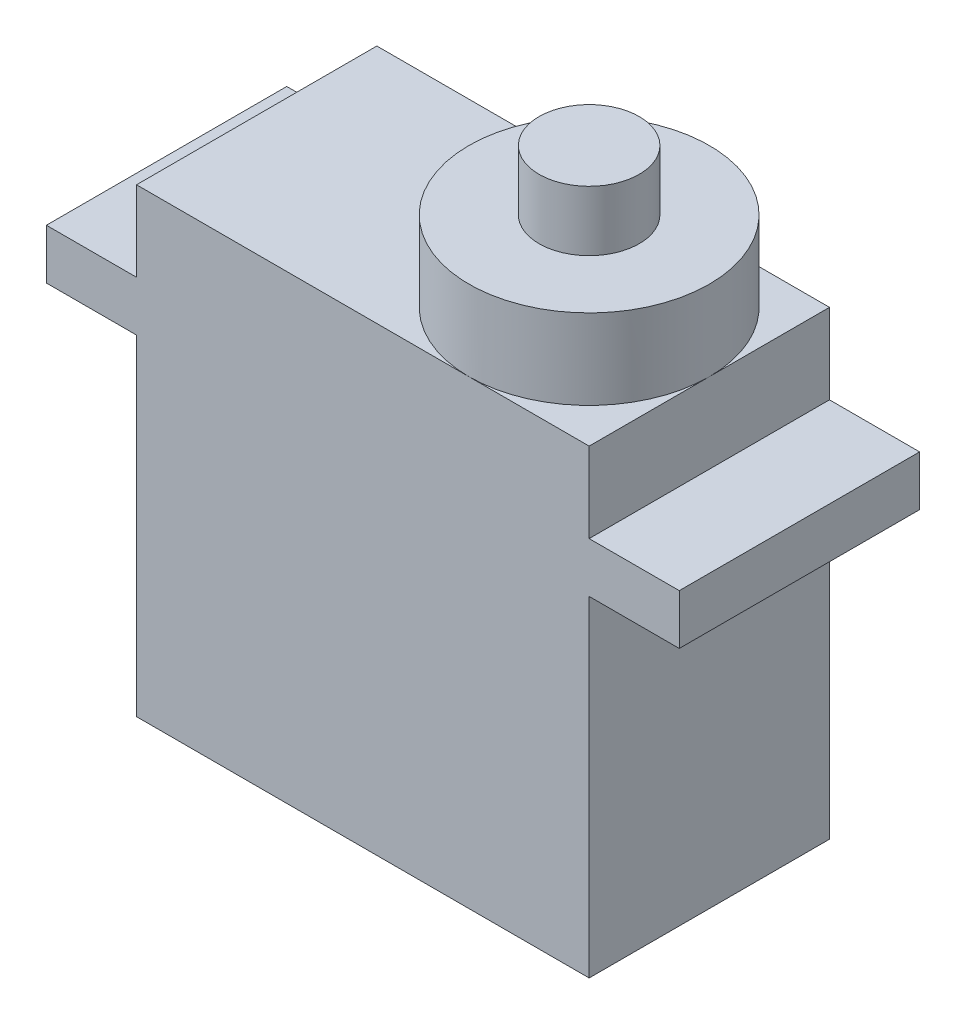
ISO-10303-21;
HEADER;
FILE_DESCRIPTION(('STEP AP214'),'2;1');
FILE_NAME('part.step','',(''),(''),'','','');
FILE_SCHEMA(('AUTOMOTIVE_DESIGN { 1 0 10303 214 1 1 1 1 }'));
ENDSEC;
DATA;
#1=APPLICATION_CONTEXT('core data for automotive mechanical design processes');
#2=APPLICATION_PROTOCOL_DEFINITION('international standard','automotive_design',2000,#1);
#3=PRODUCT_CONTEXT('',#1,'mechanical');
#4=PRODUCT('Part','Part','',(#3));
#5=PRODUCT_RELATED_PRODUCT_CATEGORY('part','',(#4));
#6=PRODUCT_DEFINITION_FORMATION('','',#4);
#7=PRODUCT_DEFINITION_CONTEXT('part definition',#1,'design');
#8=PRODUCT_DEFINITION('design','',#6,#7);
#9=PRODUCT_DEFINITION_SHAPE('','',#8);
#10=(LENGTH_UNIT() NAMED_UNIT(*) SI_UNIT(.MILLI.,.METRE.));
#11=(NAMED_UNIT(*) PLANE_ANGLE_UNIT() SI_UNIT($,.RADIAN.));
#12=(NAMED_UNIT(*) SI_UNIT($,.STERADIAN.) SOLID_ANGLE_UNIT());
#13=UNCERTAINTY_MEASURE_WITH_UNIT(LENGTH_MEASURE(1.E-05),#10,'distance_accuracy_value','');
#14=(GEOMETRIC_REPRESENTATION_CONTEXT(3) GLOBAL_UNCERTAINTY_ASSIGNED_CONTEXT((#13)) GLOBAL_UNIT_ASSIGNED_CONTEXT((#10,
#11,#12)) REPRESENTATION_CONTEXT('',''));
#15=CARTESIAN_POINT('',(0.,0.,0.));
#16=DIRECTION('',(0.,0.,1.));
#17=DIRECTION('',(1.,0.,0.));
#18=AXIS2_PLACEMENT_3D('',#15,#16,#17);
#19=CARTESIAN_POINT('',(0.,23.,12.));
#20=DIRECTION('',(0.,-1.,0.));
#21=DIRECTION('',(1.,0.,0.));
#22=AXIS2_PLACEMENT_3D('',#19,#20,#21);
#23=PLANE('',#22);
#24=CARTESIAN_POINT('',(-6.,23.,6.));
#25=DIRECTION('',(0.,1.,0.));
#26=DIRECTION('',(-1.,0.,0.));
#27=AXIS2_PLACEMENT_3D('',#24,#25,#26);
#28=CIRCLE('',#27,6.);
#29=CARTESIAN_POINT('',(-6.,23.,12.));
#30=VERTEX_POINT('',#29);
#31=CARTESIAN_POINT('',(0.,23.,6.));
#32=VERTEX_POINT('',#31);
#33=EDGE_CURVE('E168',#30,#32,#28,.T.);
#34=ORIENTED_EDGE('',*,*,#33,.F.);
#35=DIRECTION('',(-1.,0.,0.));
#36=VECTOR('',#35,1.);
#37=CARTESIAN_POINT('',(0.,23.,12.));
#38=LINE('',#37,#36);
#39=CARTESIAN_POINT('',(0.,23.,12.));
#40=VERTEX_POINT('',#39);
#41=EDGE_CURVE('E148',#40,#30,#38,.T.);
#42=ORIENTED_EDGE('',*,*,#41,.F.);
#43=DIRECTION('',(0.,0.,-1.));
#44=VECTOR('',#43,1.);
#45=CARTESIAN_POINT('',(0.,23.,12.));
#46=LINE('',#45,#44);
#47=EDGE_CURVE('E169',#40,#32,#46,.T.);
#48=ORIENTED_EDGE('',*,*,#47,.T.);
#49=EDGE_LOOP('',(#34,#42,#48));
#50=FACE_BOUND('',#49,.T.);
#51=ADVANCED_FACE('F47',(#50),#23,.F.);
#52=CARTESIAN_POINT('',(-6.,23.,0.));
#53=VERTEX_POINT('',#52);
#54=EDGE_CURVE('E57',#32,#53,#28,.T.);
#55=ORIENTED_EDGE('',*,*,#54,.F.);
#56=CARTESIAN_POINT('',(0.,23.,0.));
#57=VERTEX_POINT('',#56);
#58=EDGE_CURVE('E275',#32,#57,#46,.T.);
#59=ORIENTED_EDGE('',*,*,#58,.T.);
#60=DIRECTION('',(-1.,0.,0.));
#61=VECTOR('',#60,1.);
#62=CARTESIAN_POINT('',(0.,23.,0.));
#63=LINE('',#62,#61);
#64=EDGE_CURVE('E237',#57,#53,#63,.T.);
#65=ORIENTED_EDGE('',*,*,#64,.T.);
#66=EDGE_LOOP('',(#55,#59,#65));
#67=FACE_BOUND('',#66,.T.);
#68=ADVANCED_FACE('F350',(#67),#23,.F.);
#69=CARTESIAN_POINT('',(-22.6,0.,12.));
#70=DIRECTION('',(0.,1.,0.));
#71=DIRECTION('',(0.,0.,1.));
#72=AXIS2_PLACEMENT_3D('',#69,#70,#71);
#73=PLANE('',#72);
#74=DIRECTION('',(1.,0.,0.));
#75=VECTOR('',#74,1.);
#76=CARTESIAN_POINT('',(-22.6,0.,0.));
#77=LINE('',#76,#75);
#78=CARTESIAN_POINT('',(-22.6,0.,0.));
#79=VERTEX_POINT('',#78);
#80=CARTESIAN_POINT('',(0.,0.,0.));
#81=VERTEX_POINT('',#80);
#82=EDGE_CURVE('E216',#79,#81,#77,.T.);
#83=ORIENTED_EDGE('',*,*,#82,.T.);
#84=DIRECTION('',(0.,0.,-1.));
#85=VECTOR('',#84,1.);
#86=CARTESIAN_POINT('',(0.,0.,12.));
#87=LINE('',#86,#85);
#88=CARTESIAN_POINT('',(0.,0.,12.));
#89=VERTEX_POINT('',#88);
#90=EDGE_CURVE('E51',#89,#81,#87,.T.);
#91=ORIENTED_EDGE('',*,*,#90,.F.);
#92=DIRECTION('',(1.,0.,0.));
#93=VECTOR('',#92,1.);
#94=CARTESIAN_POINT('',(-22.6,0.,12.));
#95=LINE('',#94,#93);
#96=CARTESIAN_POINT('',(-22.6,0.,12.));
#97=VERTEX_POINT('',#96);
#98=EDGE_CURVE('E183',#97,#89,#95,.T.);
#99=ORIENTED_EDGE('',*,*,#98,.F.);
#100=DIRECTION('',(0.,0.,-1.));
#101=VECTOR('',#100,1.);
#102=CARTESIAN_POINT('',(-22.6,0.,12.));
#103=LINE('',#102,#101);
#104=EDGE_CURVE('E215',#97,#79,#103,.T.);
#105=ORIENTED_EDGE('',*,*,#104,.T.);
#106=EDGE_LOOP('',(#83,#91,#99,#105));
#107=FACE_BOUND('',#106,.T.);
#108=ADVANCED_FACE('F49',(#107),#73,.F.);
#109=CARTESIAN_POINT('',(0.,0.,12.));
#110=DIRECTION('',(-1.,0.,0.));
#111=DIRECTION('',(0.,-1.,0.));
#112=AXIS2_PLACEMENT_3D('',#109,#110,#111);
#113=PLANE('',#112);
#114=DIRECTION('',(0.,1.,0.));
#115=VECTOR('',#114,1.);
#116=CARTESIAN_POINT('',(0.,0.,0.));
#117=LINE('',#116,#115);
#118=CARTESIAN_POINT('',(0.,16.5,0.));
#119=VERTEX_POINT('',#118);
#120=EDGE_CURVE('E220',#81,#119,#117,.T.);
#121=ORIENTED_EDGE('',*,*,#120,.T.);
#122=DIRECTION('',(0.,0.,-1.));
#123=VECTOR('',#122,1.);
#124=CARTESIAN_POINT('',(0.,16.5,12.));
#125=LINE('',#124,#123);
#126=CARTESIAN_POINT('',(0.,16.5,12.));
#127=VERTEX_POINT('',#126);
#128=EDGE_CURVE('E180',#127,#119,#125,.T.);
#129=ORIENTED_EDGE('',*,*,#128,.F.);
#130=DIRECTION('',(0.,1.,0.));
#131=VECTOR('',#130,1.);
#132=CARTESIAN_POINT('',(0.,0.,12.));
#133=LINE('',#132,#131);
#134=EDGE_CURVE('E186',#89,#127,#133,.T.);
#135=ORIENTED_EDGE('',*,*,#134,.F.);
#136=ORIENTED_EDGE('',*,*,#90,.T.);
#137=EDGE_LOOP('',(#121,#129,#135,#136));
#138=FACE_BOUND('',#137,.T.);
#139=ADVANCED_FACE('F314',(#138),#113,.F.);
#140=CARTESIAN_POINT('',(0.,16.5,12.));
#141=DIRECTION('',(0.,1.,0.));
#142=DIRECTION('',(0.,0.,1.));
#143=AXIS2_PLACEMENT_3D('',#140,#141,#142);
#144=PLANE('',#143);
#145=DIRECTION('',(1.,0.,0.));
#146=VECTOR('',#145,1.);
#147=CARTESIAN_POINT('',(0.,16.5,0.));
#148=LINE('',#147,#146);
#149=CARTESIAN_POINT('',(4.5,16.5,0.));
#150=VERTEX_POINT('',#149);
#151=EDGE_CURVE('E223',#119,#150,#148,.T.);
#152=ORIENTED_EDGE('',*,*,#151,.T.);
#153=DIRECTION('',(0.,0.,-1.));
#154=VECTOR('',#153,1.);
#155=CARTESIAN_POINT('',(4.5,16.5,12.));
#156=LINE('',#155,#154);
#157=CARTESIAN_POINT('',(4.5,16.5,12.));
#158=VERTEX_POINT('',#157);
#159=EDGE_CURVE('E286',#158,#150,#156,.T.);
#160=ORIENTED_EDGE('',*,*,#159,.F.);
#161=DIRECTION('',(1.,0.,0.));
#162=VECTOR('',#161,1.);
#163=CARTESIAN_POINT('',(0.,16.5,12.));
#164=LINE('',#163,#162);
#165=EDGE_CURVE('E190',#127,#158,#164,.T.);
#166=ORIENTED_EDGE('',*,*,#165,.F.);
#167=ORIENTED_EDGE('',*,*,#128,.T.);
#168=EDGE_LOOP('',(#152,#160,#166,#167));
#169=FACE_BOUND('',#168,.T.);
#170=ADVANCED_FACE('F295',(#169),#144,.F.);
#171=CARTESIAN_POINT('',(4.5,16.5,12.));
#172=DIRECTION('',(-1.,0.,0.));
#173=DIRECTION('',(0.,0.,1.));
#174=AXIS2_PLACEMENT_3D('',#171,#172,#173);
#175=PLANE('',#174);
#176=DIRECTION('',(0.,1.,0.));
#177=VECTOR('',#176,1.);
#178=CARTESIAN_POINT('',(4.5,16.5,0.));
#179=LINE('',#178,#177);
#180=CARTESIAN_POINT('',(4.5,19.,0.));
#181=VERTEX_POINT('',#180);
#182=EDGE_CURVE('E226',#150,#181,#179,.T.);
#183=ORIENTED_EDGE('',*,*,#182,.T.);
#184=DIRECTION('',(0.,0.,-1.));
#185=VECTOR('',#184,1.);
#186=CARTESIAN_POINT('',(4.5,19.,12.));
#187=LINE('',#186,#185);
#188=CARTESIAN_POINT('',(4.5,19.,12.));
#189=VERTEX_POINT('',#188);
#190=EDGE_CURVE('E282',#189,#181,#187,.T.);
#191=ORIENTED_EDGE('',*,*,#190,.F.);
#192=DIRECTION('',(0.,1.,0.));
#193=VECTOR('',#192,1.);
#194=CARTESIAN_POINT('',(4.5,16.5,12.));
#195=LINE('',#194,#193);
#196=EDGE_CURVE('E193',#158,#189,#195,.T.);
#197=ORIENTED_EDGE('',*,*,#196,.F.);
#198=ORIENTED_EDGE('',*,*,#159,.T.);
#199=EDGE_LOOP('',(#183,#191,#197,#198));
#200=FACE_BOUND('',#199,.T.);
#201=ADVANCED_FACE('F306',(#200),#175,.F.);
#202=CARTESIAN_POINT('',(4.5,19.,12.));
#203=DIRECTION('',(0.,-1.,0.));
#204=DIRECTION('',(0.,0.,-1.));
#205=AXIS2_PLACEMENT_3D('',#202,#203,#204);
#206=PLANE('',#205);
#207=DIRECTION('',(-1.,0.,0.));
#208=VECTOR('',#207,1.);
#209=CARTESIAN_POINT('',(4.5,19.,0.));
#210=LINE('',#209,#208);
#211=CARTESIAN_POINT('',(0.,19.,0.));
#212=VERTEX_POINT('',#211);
#213=EDGE_CURVE('E229',#181,#212,#210,.T.);
#214=ORIENTED_EDGE('',*,*,#213,.T.);
#215=DIRECTION('',(0.,0.,-1.));
#216=VECTOR('',#215,1.);
#217=CARTESIAN_POINT('',(0.,19.,12.));
#218=LINE('',#217,#216);
#219=CARTESIAN_POINT('',(0.,19.,12.));
#220=VERTEX_POINT('',#219);
#221=EDGE_CURVE('E278',#220,#212,#218,.T.);
#222=ORIENTED_EDGE('',*,*,#221,.F.);
#223=DIRECTION('',(-1.,0.,0.));
#224=VECTOR('',#223,1.);
#225=CARTESIAN_POINT('',(4.5,19.,12.));
#226=LINE('',#225,#224);
#227=EDGE_CURVE('E196',#189,#220,#226,.T.);
#228=ORIENTED_EDGE('',*,*,#227,.F.);
#229=ORIENTED_EDGE('',*,*,#190,.T.);
#230=EDGE_LOOP('',(#214,#222,#228,#229));
#231=FACE_BOUND('',#230,.T.);
#232=ADVANCED_FACE('F310',(#231),#206,.F.);
#233=CARTESIAN_POINT('',(0.,19.,12.));
#234=DIRECTION('',(-1.,0.,0.));
#235=DIRECTION('',(0.,-1.,0.));
#236=AXIS2_PLACEMENT_3D('',#233,#234,#235);
#237=PLANE('',#236);
#238=DIRECTION('',(0.,1.,0.));
#239=VECTOR('',#238,1.);
#240=CARTESIAN_POINT('',(0.,19.,0.));
#241=LINE('',#240,#239);
#242=EDGE_CURVE('E232',#212,#57,#241,.T.);
#243=ORIENTED_EDGE('',*,*,#242,.T.);
#244=ORIENTED_EDGE('',*,*,#58,.F.);
#245=ORIENTED_EDGE('',*,*,#47,.F.);
#246=DIRECTION('',(0.,1.,0.));
#247=VECTOR('',#246,1.);
#248=CARTESIAN_POINT('',(0.,19.,12.));
#249=LINE('',#248,#247);
#250=EDGE_CURVE('E154',#220,#40,#249,.T.);
#251=ORIENTED_EDGE('',*,*,#250,.F.);
#252=ORIENTED_EDGE('',*,*,#221,.T.);
#253=EDGE_LOOP('',(#243,#244,#245,#251,#252));
#254=FACE_BOUND('',#253,.T.);
#255=ADVANCED_FACE('F348',(#254),#237,.F.);
#256=EDGE_CURVE('E72',#53,#30,#28,.T.);
#257=ORIENTED_EDGE('',*,*,#256,.F.);
#258=CARTESIAN_POINT('',(-22.6,23.,0.));
#259=VERTEX_POINT('',#258);
#260=EDGE_CURVE('E236',#53,#259,#63,.T.);
#261=ORIENTED_EDGE('',*,*,#260,.T.);
#262=DIRECTION('',(0.,0.,-1.));
#263=VECTOR('',#262,1.);
#264=CARTESIAN_POINT('',(-22.6,23.,12.));
#265=LINE('',#264,#263);
#266=CARTESIAN_POINT('',(-22.6,23.,12.));
#267=VERTEX_POINT('',#266);
#268=EDGE_CURVE('E164',#267,#259,#265,.T.);
#269=ORIENTED_EDGE('',*,*,#268,.F.);
#270=EDGE_CURVE('E151',#30,#267,#38,.T.);
#271=ORIENTED_EDGE('',*,*,#270,.F.);
#272=EDGE_LOOP('',(#257,#261,#269,#271));
#273=FACE_BOUND('',#272,.T.);
#274=ADVANCED_FACE('F162',(#273),#23,.F.);
#275=CARTESIAN_POINT('',(-22.6,23.,12.));
#276=DIRECTION('',(1.,0.,0.));
#277=DIRECTION('',(0.,1.,0.));
#278=AXIS2_PLACEMENT_3D('',#275,#276,#277);
#279=PLANE('',#278);
#280=DIRECTION('',(0.,-1.,0.));
#281=VECTOR('',#280,1.);
#282=CARTESIAN_POINT('',(-22.6,23.,0.));
#283=LINE('',#282,#281);
#284=CARTESIAN_POINT('',(-22.6,19.,0.));
#285=VERTEX_POINT('',#284);
#286=EDGE_CURVE('E240',#259,#285,#283,.T.);
#287=ORIENTED_EDGE('',*,*,#286,.T.);
#288=DIRECTION('',(0.,0.,-1.));
#289=VECTOR('',#288,1.);
#290=CARTESIAN_POINT('',(-22.6,19.,12.));
#291=LINE('',#290,#289);
#292=CARTESIAN_POINT('',(-22.6,19.,12.));
#293=VERTEX_POINT('',#292);
#294=EDGE_CURVE('E269',#293,#285,#291,.T.);
#295=ORIENTED_EDGE('',*,*,#294,.F.);
#296=DIRECTION('',(0.,-1.,0.));
#297=VECTOR('',#296,1.);
#298=CARTESIAN_POINT('',(-22.6,23.,12.));
#299=LINE('',#298,#297);
#300=EDGE_CURVE('E160',#267,#293,#299,.T.);
#301=ORIENTED_EDGE('',*,*,#300,.F.);
#302=ORIENTED_EDGE('',*,*,#268,.T.);
#303=EDGE_LOOP('',(#287,#295,#301,#302));
#304=FACE_BOUND('',#303,.T.);
#305=ADVANCED_FACE('F339',(#304),#279,.F.);
#306=CARTESIAN_POINT('',(-22.6,19.,12.));
#307=DIRECTION('',(0.,-1.,0.));
#308=DIRECTION('',(0.,0.,-1.));
#309=AXIS2_PLACEMENT_3D('',#306,#307,#308);
#310=PLANE('',#309);
#311=DIRECTION('',(-1.,0.,0.));
#312=VECTOR('',#311,1.);
#313=CARTESIAN_POINT('',(-22.6,19.,0.));
#314=LINE('',#313,#312);
#315=CARTESIAN_POINT('',(-27.1,19.,0.));
#316=VERTEX_POINT('',#315);
#317=EDGE_CURVE('E243',#285,#316,#314,.T.);
#318=ORIENTED_EDGE('',*,*,#317,.T.);
#319=DIRECTION('',(0.,0.,-1.));
#320=VECTOR('',#319,1.);
#321=CARTESIAN_POINT('',(-27.1,19.,12.));
#322=LINE('',#321,#320);
#323=CARTESIAN_POINT('',(-27.1,19.,12.));
#324=VERTEX_POINT('',#323);
#325=EDGE_CURVE('E265',#324,#316,#322,.T.);
#326=ORIENTED_EDGE('',*,*,#325,.F.);
#327=DIRECTION('',(-1.,0.,0.));
#328=VECTOR('',#327,1.);
#329=CARTESIAN_POINT('',(-22.6,19.,12.));
#330=LINE('',#329,#328);
#331=EDGE_CURVE('E203',#293,#324,#330,.T.);
#332=ORIENTED_EDGE('',*,*,#331,.F.);
#333=ORIENTED_EDGE('',*,*,#294,.T.);
#334=EDGE_LOOP('',(#318,#326,#332,#333));
#335=FACE_BOUND('',#334,.T.);
#336=ADVANCED_FACE('F335',(#335),#310,.F.);
#337=CARTESIAN_POINT('',(-27.1,19.,12.));
#338=DIRECTION('',(1.,0.,0.));
#339=DIRECTION('',(0.,0.,-1.));
#340=AXIS2_PLACEMENT_3D('',#337,#338,#339);
#341=PLANE('',#340);
#342=DIRECTION('',(0.,-1.,0.));
#343=VECTOR('',#342,1.);
#344=CARTESIAN_POINT('',(-27.1,19.,0.));
#345=LINE('',#344,#343);
#346=CARTESIAN_POINT('',(-27.1,16.5,0.));
#347=VERTEX_POINT('',#346);
#348=EDGE_CURVE('E246',#316,#347,#345,.T.);
#349=ORIENTED_EDGE('',*,*,#348,.T.);
#350=DIRECTION('',(0.,0.,-1.));
#351=VECTOR('',#350,1.);
#352=CARTESIAN_POINT('',(-27.1,16.5,12.));
#353=LINE('',#352,#351);
#354=CARTESIAN_POINT('',(-27.1,16.5,12.));
#355=VERTEX_POINT('',#354);
#356=EDGE_CURVE('E261',#355,#347,#353,.T.);
#357=ORIENTED_EDGE('',*,*,#356,.F.);
#358=DIRECTION('',(0.,-1.,0.));
#359=VECTOR('',#358,1.);
#360=CARTESIAN_POINT('',(-27.1,19.,12.));
#361=LINE('',#360,#359);
#362=EDGE_CURVE('E206',#324,#355,#361,.T.);
#363=ORIENTED_EDGE('',*,*,#362,.F.);
#364=ORIENTED_EDGE('',*,*,#325,.T.);
#365=EDGE_LOOP('',(#349,#357,#363,#364));
#366=FACE_BOUND('',#365,.T.);
#367=ADVANCED_FACE('F330',(#366),#341,.F.);
#368=CARTESIAN_POINT('',(-27.1,16.5,12.));
#369=DIRECTION('',(0.,1.,0.));
#370=DIRECTION('',(0.,0.,1.));
#371=AXIS2_PLACEMENT_3D('',#368,#369,#370);
#372=PLANE('',#371);
#373=DIRECTION('',(1.,0.,0.));
#374=VECTOR('',#373,1.);
#375=CARTESIAN_POINT('',(-27.1,16.5,0.));
#376=LINE('',#375,#374);
#377=CARTESIAN_POINT('',(-22.6,16.5,0.));
#378=VERTEX_POINT('',#377);
#379=EDGE_CURVE('E249',#347,#378,#376,.T.);
#380=ORIENTED_EDGE('',*,*,#379,.T.);
#381=DIRECTION('',(0.,0.,-1.));
#382=VECTOR('',#381,1.);
#383=CARTESIAN_POINT('',(-22.6,16.5,12.));
#384=LINE('',#383,#382);
#385=CARTESIAN_POINT('',(-22.6,16.5,12.));
#386=VERTEX_POINT('',#385);
#387=EDGE_CURVE('E257',#386,#378,#384,.T.);
#388=ORIENTED_EDGE('',*,*,#387,.F.);
#389=DIRECTION('',(1.,0.,0.));
#390=VECTOR('',#389,1.);
#391=CARTESIAN_POINT('',(-27.1,16.5,12.));
#392=LINE('',#391,#390);
#393=EDGE_CURVE('E209',#355,#386,#392,.T.);
#394=ORIENTED_EDGE('',*,*,#393,.F.);
#395=ORIENTED_EDGE('',*,*,#356,.T.);
#396=EDGE_LOOP('',(#380,#388,#394,#395));
#397=FACE_BOUND('',#396,.T.);
#398=ADVANCED_FACE('F326',(#397),#372,.F.);
#399=CARTESIAN_POINT('',(-22.6,16.5,12.));
#400=DIRECTION('',(1.,0.,0.));
#401=DIRECTION('',(0.,1.,0.));
#402=AXIS2_PLACEMENT_3D('',#399,#400,#401);
#403=PLANE('',#402);
#404=DIRECTION('',(0.,-1.,0.));
#405=VECTOR('',#404,1.);
#406=CARTESIAN_POINT('',(-22.6,16.5,0.));
#407=LINE('',#406,#405);
#408=EDGE_CURVE('E187',#378,#79,#407,.T.);
#409=ORIENTED_EDGE('',*,*,#408,.T.);
#410=ORIENTED_EDGE('',*,*,#104,.F.);
#411=DIRECTION('',(0.,-1.,0.));
#412=VECTOR('',#411,1.);
#413=CARTESIAN_POINT('',(-22.6,16.5,12.));
#414=LINE('',#413,#412);
#415=EDGE_CURVE('E212',#386,#97,#414,.T.);
#416=ORIENTED_EDGE('',*,*,#415,.F.);
#417=ORIENTED_EDGE('',*,*,#387,.T.);
#418=EDGE_LOOP('',(#409,#410,#416,#417));
#419=FACE_BOUND('',#418,.T.);
#420=ADVANCED_FACE('F321',(#419),#403,.F.);
#421=CARTESIAN_POINT('',(0.,0.,12.));
#422=DIRECTION('',(0.,0.,1.));
#423=DIRECTION('',(1.,0.,0.));
#424=AXIS2_PLACEMENT_3D('',#421,#422,#423);
#425=PLANE('',#424);
#426=ORIENTED_EDGE('',*,*,#98,.T.);
#427=ORIENTED_EDGE('',*,*,#134,.T.);
#428=ORIENTED_EDGE('',*,*,#165,.T.);
#429=ORIENTED_EDGE('',*,*,#196,.T.);
#430=ORIENTED_EDGE('',*,*,#227,.T.);
#431=ORIENTED_EDGE('',*,*,#250,.T.);
#432=ORIENTED_EDGE('',*,*,#41,.T.);
#433=ORIENTED_EDGE('',*,*,#270,.T.);
#434=ORIENTED_EDGE('',*,*,#300,.T.);
#435=ORIENTED_EDGE('',*,*,#331,.T.);
#436=ORIENTED_EDGE('',*,*,#362,.T.);
#437=ORIENTED_EDGE('',*,*,#393,.T.);
#438=ORIENTED_EDGE('',*,*,#415,.T.);
#439=EDGE_LOOP('',(#426,#427,#428,#429,#430,#431,#432,#433,#434,#435,#436,#437,#438));
#440=FACE_BOUND('',#439,.T.);
#441=ADVANCED_FACE('F150',(#440),#425,.T.);
#442=CARTESIAN_POINT('',(0.,0.,0.));
#443=DIRECTION('',(0.,0.,1.));
#444=DIRECTION('',(1.,0.,0.));
#445=AXIS2_PLACEMENT_3D('',#442,#443,#444);
#446=PLANE('',#445);
#447=ORIENTED_EDGE('',*,*,#82,.F.);
#448=ORIENTED_EDGE('',*,*,#408,.F.);
#449=ORIENTED_EDGE('',*,*,#379,.F.);
#450=ORIENTED_EDGE('',*,*,#348,.F.);
#451=ORIENTED_EDGE('',*,*,#317,.F.);
#452=ORIENTED_EDGE('',*,*,#286,.F.);
#453=ORIENTED_EDGE('',*,*,#260,.F.);
#454=ORIENTED_EDGE('',*,*,#64,.F.);
#455=ORIENTED_EDGE('',*,*,#242,.F.);
#456=ORIENTED_EDGE('',*,*,#213,.F.);
#457=ORIENTED_EDGE('',*,*,#182,.F.);
#458=ORIENTED_EDGE('',*,*,#151,.F.);
#459=ORIENTED_EDGE('',*,*,#120,.F.);
#460=EDGE_LOOP('',(#447,#448,#449,#450,#451,#452,#453,#454,#455,#456,#457,#458,#459));
#461=FACE_BOUND('',#460,.T.);
#462=ADVANCED_FACE('F301',(#461),#446,.F.);
#463=CARTESIAN_POINT('',(-6.00000000000001,27.,6.));
#464=DIRECTION('',(0.,-1.,0.));
#465=DIRECTION('',(1.,0.,0.));
#466=AXIS2_PLACEMENT_3D('',#463,#464,#465);
#467=CYLINDRICAL_SURFACE('',#466,6.);
#468=CARTESIAN_POINT('',(-6.00000000000001,27.,6.));
#469=DIRECTION('',(0.,1.,0.));
#470=DIRECTION('',(-1.,0.,0.));
#471=AXIS2_PLACEMENT_3D('',#468,#469,#470);
#472=CIRCLE('',#471,6.);
#473=CARTESIAN_POINT('',(-12.,27.,6.));
#474=VERTEX_POINT('',#473);
#475=EDGE_CURVE('E172',#474,#474,#472,.T.);
#476=ORIENTED_EDGE('',*,*,#475,.F.);
#477=EDGE_LOOP('',(#476));
#478=FACE_BOUND('',#477,.T.);
#479=ORIENTED_EDGE('',*,*,#33,.T.);
#480=ORIENTED_EDGE('',*,*,#54,.T.);
#481=ORIENTED_EDGE('',*,*,#256,.T.);
#482=EDGE_LOOP('',(#479,#480,#481));
#483=FACE_BOUND('',#482,.T.);
#484=ADVANCED_FACE('F175',(#478,#483),#467,.T.);
#485=CARTESIAN_POINT('',(0.,27.,0.));
#486=DIRECTION('',(0.,1.,0.));
#487=DIRECTION('',(-1.,0.,0.));
#488=AXIS2_PLACEMENT_3D('',#485,#486,#487);
#489=PLANE('',#488);
#490=CARTESIAN_POINT('',(-6.00000000000001,27.,6.));
#491=DIRECTION('',(0.,1.,0.));
#492=DIRECTION('',(-1.,0.,0.));
#493=AXIS2_PLACEMENT_3D('',#490,#491,#492);
#494=CIRCLE('',#493,2.5);
#495=CARTESIAN_POINT('',(-8.50000000000001,27.,6.));
#496=VERTEX_POINT('',#495);
#497=EDGE_CURVE('E11',#496,#496,#494,.T.);
#498=ORIENTED_EDGE('',*,*,#497,.F.);
#499=EDGE_LOOP('',(#498));
#500=FACE_BOUND('',#499,.T.);
#501=ORIENTED_EDGE('',*,*,#475,.T.);
#502=EDGE_LOOP('',(#501));
#503=FACE_BOUND('',#502,.T.);
#504=ADVANCED_FACE('F472',(#500,#503),#489,.T.);
#505=CARTESIAN_POINT('',(-6.00000000000001,30.,6.));
#506=DIRECTION('',(0.,-1.,0.));
#507=DIRECTION('',(1.,0.,0.));
#508=AXIS2_PLACEMENT_3D('',#505,#506,#507);
#509=CYLINDRICAL_SURFACE('',#508,2.5);
#510=CARTESIAN_POINT('',(-6.00000000000001,30.,6.));
#511=DIRECTION('',(0.,1.,0.));
#512=DIRECTION('',(-1.,0.,0.));
#513=AXIS2_PLACEMENT_3D('',#510,#511,#512);
#514=CIRCLE('',#513,2.5);
#515=CARTESIAN_POINT('',(-8.50000000000001,30.,6.));
#516=VERTEX_POINT('',#515);
#517=EDGE_CURVE('E173',#516,#516,#514,.T.);
#518=ORIENTED_EDGE('',*,*,#517,.F.);
#519=EDGE_LOOP('',(#518));
#520=FACE_BOUND('',#519,.T.);
#521=ORIENTED_EDGE('',*,*,#497,.T.);
#522=EDGE_LOOP('',(#521));
#523=FACE_BOUND('',#522,.T.);
#524=ADVANCED_FACE('F482',(#520,#523),#509,.T.);
#525=CARTESIAN_POINT('',(-6.00000000000001,30.,6.));
#526=DIRECTION('',(0.,1.,0.));
#527=DIRECTION('',(-1.,0.,0.));
#528=AXIS2_PLACEMENT_3D('',#525,#526,#527);
#529=PLANE('',#528);
#530=ORIENTED_EDGE('',*,*,#517,.T.);
#531=EDGE_LOOP('',(#530));
#532=FACE_BOUND('',#531,.T.);
#533=ADVANCED_FACE('F495',(#532),#529,.T.);
#534=CLOSED_SHELL('',(#51,#68,#108,#139,#170,#201,#232,#255,#274,#305,#336,#367,#398,#420,#441,
#462,#484,#504,#524,#533));
#535=MANIFOLD_SOLID_BREP('B2',#534);
#536=ADVANCED_BREP_SHAPE_REPRESENTATION('',(#18,#535),#14);
#537=SHAPE_DEFINITION_REPRESENTATION(#9,#536);
ENDSEC;
END-ISO-10303-21;
